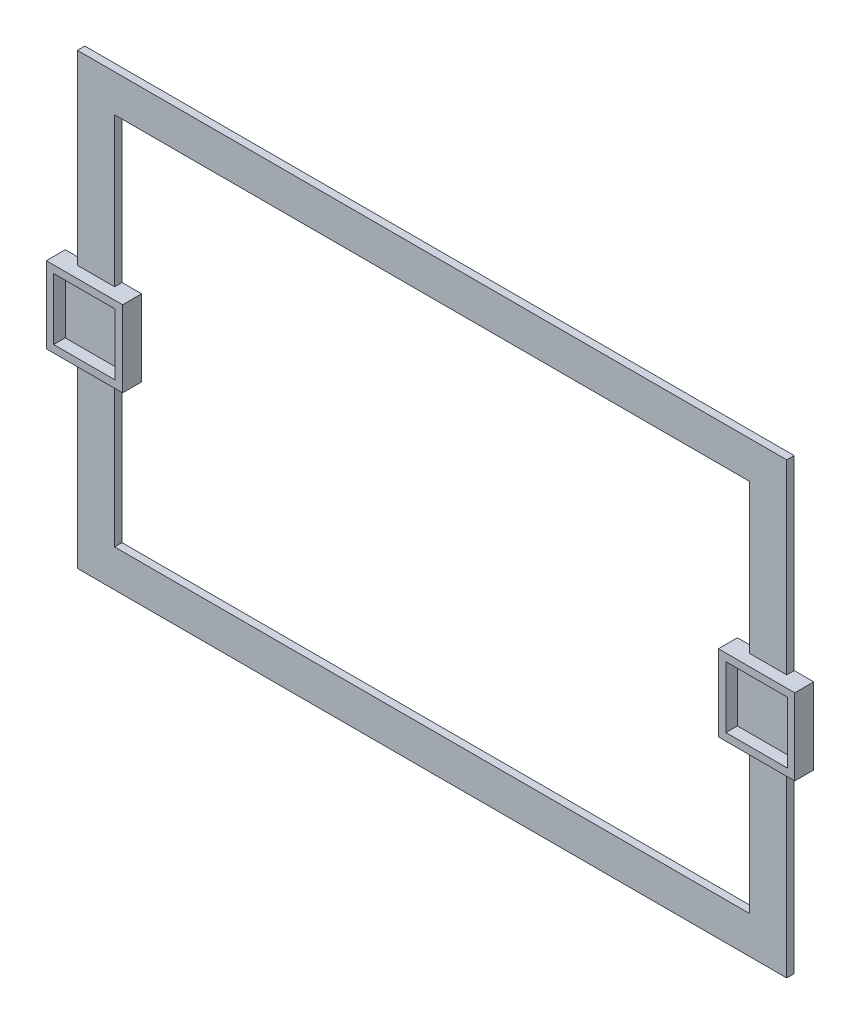
ISO-10303-21;
HEADER;
FILE_DESCRIPTION(('STEP AP214'),'2;1');
FILE_NAME('part.step','',(''),(''),'','','');
FILE_SCHEMA(('AUTOMOTIVE_DESIGN { 1 0 10303 214 1 1 1 1 }'));
ENDSEC;
DATA;
#1=APPLICATION_CONTEXT('core data for automotive mechanical design processes');
#2=APPLICATION_PROTOCOL_DEFINITION('international standard','automotive_design',2000,#1);
#3=PRODUCT_CONTEXT('',#1,'mechanical');
#4=PRODUCT('Part','Part','',(#3));
#5=PRODUCT_RELATED_PRODUCT_CATEGORY('part','',(#4));
#6=PRODUCT_DEFINITION_FORMATION('','',#4);
#7=PRODUCT_DEFINITION_CONTEXT('part definition',#1,'design');
#8=PRODUCT_DEFINITION('design','',#6,#7);
#9=PRODUCT_DEFINITION_SHAPE('','',#8);
#10=(LENGTH_UNIT() NAMED_UNIT(*) SI_UNIT(.MILLI.,.METRE.));
#11=(NAMED_UNIT(*) PLANE_ANGLE_UNIT() SI_UNIT($,.RADIAN.));
#12=(NAMED_UNIT(*) SI_UNIT($,.STERADIAN.) SOLID_ANGLE_UNIT());
#13=UNCERTAINTY_MEASURE_WITH_UNIT(LENGTH_MEASURE(1.E-05),#10,'distance_accuracy_value','');
#14=(GEOMETRIC_REPRESENTATION_CONTEXT(3) GLOBAL_UNCERTAINTY_ASSIGNED_CONTEXT((#13)) GLOBAL_UNIT_ASSIGNED_CONTEXT((#10,
#11,#12)) REPRESENTATION_CONTEXT('',''));
#15=CARTESIAN_POINT('',(0.,0.,0.));
#16=DIRECTION('',(0.,0.,1.));
#17=DIRECTION('',(1.,0.,0.));
#18=AXIS2_PLACEMENT_3D('',#15,#16,#17);
#19=CARTESIAN_POINT('',(0.,0.,0.));
#20=DIRECTION('',(0.,0.,-1.));
#21=DIRECTION('',(-1.,0.,0.));
#22=AXIS2_PLACEMENT_3D('',#19,#20,#21);
#23=PLANE('',#22);
#24=DIRECTION('',(1.,0.,0.));
#25=VECTOR('',#24,1.);
#26=CARTESIAN_POINT('',(453.39,-5.07999999999991,0.));
#27=LINE('',#26,#25);
#28=CARTESIAN_POINT('',(466.725,-5.07999999999991,0.));
#29=VERTEX_POINT('',#28);
#30=CARTESIAN_POINT('',(492.125,-5.07999999999991,0.));
#31=VERTEX_POINT('',#30);
#32=EDGE_CURVE('E270',#29,#31,#27,.T.);
#33=ORIENTED_EDGE('',*,*,#32,.F.);
#34=DIRECTION('',(0.,-1.,0.));
#35=VECTOR('',#34,1.);
#36=CARTESIAN_POINT('',(466.725,0.,0.));
#37=LINE('',#36,#35);
#38=CARTESIAN_POINT('',(466.725,-106.68,0.));
#39=VERTEX_POINT('',#38);
#40=EDGE_CURVE('E354',#29,#39,#37,.T.);
#41=ORIENTED_EDGE('',*,*,#40,.T.);
#42=DIRECTION('',(1.,0.,0.));
#43=VECTOR('',#42,1.);
#44=CARTESIAN_POINT('',(0.,-106.68,0.));
#45=LINE('',#44,#43);
#46=CARTESIAN_POINT('',(33.655,-106.68,0.));
#47=VERTEX_POINT('',#46);
#48=EDGE_CURVE('E360',#47,#39,#45,.T.);
#49=ORIENTED_EDGE('',*,*,#48,.F.);
#50=DIRECTION('',(0.,-1.,0.));
#51=VECTOR('',#50,1.);
#52=CARTESIAN_POINT('',(33.655,0.,0.));
#53=LINE('',#52,#51);
#54=CARTESIAN_POINT('',(33.655,-5.08,0.));
#55=VERTEX_POINT('',#54);
#56=EDGE_CURVE('E393',#55,#47,#53,.T.);
#57=ORIENTED_EDGE('',*,*,#56,.F.);
#58=DIRECTION('',(-1.,0.,0.));
#59=VECTOR('',#58,1.);
#60=CARTESIAN_POINT('',(0.,-5.08,0.));
#61=LINE('',#60,#59);
#62=CARTESIAN_POINT('',(8.25499999999999,-5.08,0.));
#63=VERTEX_POINT('',#62);
#64=EDGE_CURVE('E389',#55,#63,#61,.T.);
#65=ORIENTED_EDGE('',*,*,#64,.T.);
#66=DIRECTION('',(0.,-1.,0.));
#67=VECTOR('',#66,1.);
#68=CARTESIAN_POINT('',(8.255,0.,0.));
#69=LINE('',#68,#67);
#70=CARTESIAN_POINT('',(8.25499999999998,-132.08,0.));
#71=VERTEX_POINT('',#70);
#72=EDGE_CURVE('E385',#63,#71,#69,.T.);
#73=ORIENTED_EDGE('',*,*,#72,.T.);
#74=DIRECTION('',(-1.,0.,0.));
#75=VECTOR('',#74,1.);
#76=CARTESIAN_POINT('',(0.,-132.08,0.));
#77=LINE('',#76,#75);
#78=CARTESIAN_POINT('',(492.125,-132.08,0.));
#79=VERTEX_POINT('',#78);
#80=EDGE_CURVE('E381',#79,#71,#77,.T.);
#81=ORIENTED_EDGE('',*,*,#80,.F.);
#82=DIRECTION('',(0.,-1.,0.));
#83=VECTOR('',#82,1.);
#84=CARTESIAN_POINT('',(492.125,0.,0.));
#85=LINE('',#84,#83);
#86=EDGE_CURVE('E378',#31,#79,#85,.T.);
#87=ORIENTED_EDGE('',*,*,#86,.F.);
#88=EDGE_LOOP('',(#33,#41,#49,#57,#65,#73,#81,#87));
#89=FACE_BOUND('',#88,.T.);
#90=ADVANCED_FACE('F41',(#89),#23,.F.);
#91=DIRECTION('',(-1.,0.,0.));
#92=VECTOR('',#91,1.);
#93=CARTESIAN_POINT('',(453.39,46.9900000000001,0.));
#94=LINE('',#93,#92);
#95=CARTESIAN_POINT('',(492.125,46.9900000000001,0.));
#96=VERTEX_POINT('',#95);
#97=CARTESIAN_POINT('',(466.725,46.9900000000001,0.));
#98=VERTEX_POINT('',#97);
#99=EDGE_CURVE('E309',#96,#98,#94,.T.);
#100=ORIENTED_EDGE('',*,*,#99,.F.);
#101=DIRECTION('',(0.,1.,0.));
#102=VECTOR('',#101,1.);
#103=CARTESIAN_POINT('',(492.125,0.,0.));
#104=LINE('',#103,#102);
#105=CARTESIAN_POINT('',(492.125,173.99,0.));
#106=VERTEX_POINT('',#105);
#107=EDGE_CURVE('E432',#96,#106,#104,.T.);
#108=ORIENTED_EDGE('',*,*,#107,.T.);
#109=DIRECTION('',(1.,0.,0.));
#110=VECTOR('',#109,1.);
#111=CARTESIAN_POINT('',(0.,173.99,0.));
#112=LINE('',#111,#110);
#113=CARTESIAN_POINT('',(8.25500000000001,173.99,0.));
#114=VERTEX_POINT('',#113);
#115=EDGE_CURVE('E467',#114,#106,#112,.T.);
#116=ORIENTED_EDGE('',*,*,#115,.F.);
#117=DIRECTION('',(0.,1.,0.));
#118=VECTOR('',#117,1.);
#119=CARTESIAN_POINT('',(8.25500000000001,0.,0.));
#120=LINE('',#119,#118);
#121=CARTESIAN_POINT('',(8.25500000000001,46.99,0.));
#122=VERTEX_POINT('',#121);
#123=EDGE_CURVE('E464',#122,#114,#120,.T.);
#124=ORIENTED_EDGE('',*,*,#123,.F.);
#125=DIRECTION('',(1.,0.,0.));
#126=VECTOR('',#125,1.);
#127=CARTESIAN_POINT('',(0.,46.99,0.));
#128=LINE('',#127,#126);
#129=CARTESIAN_POINT('',(33.655,46.99,0.));
#130=VERTEX_POINT('',#129);
#131=EDGE_CURVE('E460',#122,#130,#128,.T.);
#132=ORIENTED_EDGE('',*,*,#131,.T.);
#133=DIRECTION('',(0.,1.,0.));
#134=VECTOR('',#133,1.);
#135=CARTESIAN_POINT('',(33.655,0.,0.));
#136=LINE('',#135,#134);
#137=CARTESIAN_POINT('',(33.655,148.59,0.));
#138=VERTEX_POINT('',#137);
#139=EDGE_CURVE('E456',#130,#138,#136,.T.);
#140=ORIENTED_EDGE('',*,*,#139,.T.);
#141=DIRECTION('',(-1.,0.,0.));
#142=VECTOR('',#141,1.);
#143=CARTESIAN_POINT('',(0.,148.59,0.));
#144=LINE('',#143,#142);
#145=CARTESIAN_POINT('',(466.725,148.59,0.));
#146=VERTEX_POINT('',#145);
#147=EDGE_CURVE('E452',#146,#138,#144,.T.);
#148=ORIENTED_EDGE('',*,*,#147,.F.);
#149=DIRECTION('',(0.,1.,0.));
#150=VECTOR('',#149,1.);
#151=CARTESIAN_POINT('',(466.725,0.,0.));
#152=LINE('',#151,#150);
#153=EDGE_CURVE('E427',#98,#146,#152,.T.);
#154=ORIENTED_EDGE('',*,*,#153,.F.);
#155=EDGE_LOOP('',(#100,#108,#116,#124,#132,#140,#148,#154));
#156=FACE_BOUND('',#155,.T.);
#157=ADVANCED_FACE('F661',(#156),#23,.F.);
#158=CARTESIAN_POINT('',(0.,0.,7.874));
#159=DIRECTION('',(0.,0.,1.));
#160=DIRECTION('',(1.,0.,0.));
#161=AXIS2_PLACEMENT_3D('',#158,#159,#160);
#162=PLANE('',#161);
#163=DIRECTION('',(0.,-1.,0.));
#164=VECTOR('',#163,1.);
#165=CARTESIAN_POINT('',(-5.08,46.99,7.874));
#166=LINE('',#165,#164);
#167=CARTESIAN_POINT('',(-5.08,46.99,7.874));
#168=VERTEX_POINT('',#167);
#169=CARTESIAN_POINT('',(-5.07999999999999,-5.08,7.874));
#170=VERTEX_POINT('',#169);
#171=EDGE_CURVE('E562',#168,#170,#166,.T.);
#172=ORIENTED_EDGE('',*,*,#171,.T.);
#173=DIRECTION('',(1.,0.,0.));
#174=VECTOR('',#173,1.);
#175=CARTESIAN_POINT('',(-5.07999999999999,-5.08,7.874));
#176=LINE('',#175,#174);
#177=CARTESIAN_POINT('',(46.99,-5.08,7.874));
#178=VERTEX_POINT('',#177);
#179=EDGE_CURVE('E566',#170,#178,#176,.T.);
#180=ORIENTED_EDGE('',*,*,#179,.T.);
#181=DIRECTION('',(0.,1.,0.));
#182=VECTOR('',#181,1.);
#183=CARTESIAN_POINT('',(46.99,46.99,7.874));
#184=LINE('',#183,#182);
#185=CARTESIAN_POINT('',(46.99,46.99,7.874));
#186=VERTEX_POINT('',#185);
#187=EDGE_CURVE('E569',#178,#186,#184,.T.);
#188=ORIENTED_EDGE('',*,*,#187,.T.);
#189=DIRECTION('',(-1.,0.,0.));
#190=VECTOR('',#189,1.);
#191=CARTESIAN_POINT('',(-5.08,46.99,7.874));
#192=LINE('',#191,#190);
#193=EDGE_CURVE('E572',#186,#168,#192,.T.);
#194=ORIENTED_EDGE('',*,*,#193,.T.);
#195=EDGE_LOOP('',(#172,#180,#188,#194));
#196=FACE_BOUND('',#195,.T.);
#197=DIRECTION('',(1.,0.,0.));
#198=VECTOR('',#197,1.);
#199=CARTESIAN_POINT('',(0.,0.,7.874));
#200=LINE('',#199,#198);
#201=CARTESIAN_POINT('',(0.,0.,7.874));
#202=VERTEX_POINT('',#201);
#203=CARTESIAN_POINT('',(41.91,0.,7.874));
#204=VERTEX_POINT('',#203);
#205=EDGE_CURVE('E524',#202,#204,#200,.T.);
#206=ORIENTED_EDGE('',*,*,#205,.F.);
#207=DIRECTION('',(0.,-1.,0.));
#208=VECTOR('',#207,1.);
#209=CARTESIAN_POINT('',(0.,0.,7.874));
#210=LINE('',#209,#208);
#211=CARTESIAN_POINT('',(0.,41.91,7.874));
#212=VERTEX_POINT('',#211);
#213=EDGE_CURVE('E521',#212,#202,#210,.T.);
#214=ORIENTED_EDGE('',*,*,#213,.F.);
#215=DIRECTION('',(-1.,0.,0.));
#216=VECTOR('',#215,1.);
#217=CARTESIAN_POINT('',(0.,41.91,7.874));
#218=LINE('',#217,#216);
#219=CARTESIAN_POINT('',(41.91,41.91,7.874));
#220=VERTEX_POINT('',#219);
#221=EDGE_CURVE('E532',#220,#212,#218,.T.);
#222=ORIENTED_EDGE('',*,*,#221,.F.);
#223=DIRECTION('',(0.,1.,0.));
#224=VECTOR('',#223,1.);
#225=CARTESIAN_POINT('',(41.91,0.,7.874));
#226=LINE('',#225,#224);
#227=EDGE_CURVE('E528',#204,#220,#226,.T.);
#228=ORIENTED_EDGE('',*,*,#227,.F.);
#229=EDGE_LOOP('',(#206,#214,#222,#228));
#230=FACE_BOUND('',#229,.T.);
#231=ADVANCED_FACE('F701',(#196,#230),#162,.T.);
#232=CARTESIAN_POINT('',(-5.08,46.99,7.874));
#233=DIRECTION('',(1.,0.,0.));
#234=DIRECTION('',(0.,1.,0.));
#235=AXIS2_PLACEMENT_3D('',#232,#233,#234);
#236=PLANE('',#235);
#237=DIRECTION('',(0.,0.,-1.));
#238=VECTOR('',#237,1.);
#239=CARTESIAN_POINT('',(-5.08,46.99,7.874));
#240=LINE('',#239,#238);
#241=CARTESIAN_POINT('',(-5.07999999999999,46.99,-5.08));
#242=VERTEX_POINT('',#241);
#243=EDGE_CURVE('E575',#168,#242,#240,.T.);
#244=ORIENTED_EDGE('',*,*,#243,.T.);
#245=DIRECTION('',(0.,1.,0.));
#246=VECTOR('',#245,1.);
#247=CARTESIAN_POINT('',(-5.07999999999999,-5.08,-5.08));
#248=LINE('',#247,#246);
#249=CARTESIAN_POINT('',(-5.07999999999999,-5.08,-5.08));
#250=VERTEX_POINT('',#249);
#251=EDGE_CURVE('E502',#250,#242,#248,.T.);
#252=ORIENTED_EDGE('',*,*,#251,.F.);
#253=DIRECTION('',(0.,0.,-1.));
#254=VECTOR('',#253,1.);
#255=CARTESIAN_POINT('',(-5.07999999999999,-5.08,7.874));
#256=LINE('',#255,#254);
#257=EDGE_CURVE('E11',#170,#250,#256,.T.);
#258=ORIENTED_EDGE('',*,*,#257,.F.);
#259=ORIENTED_EDGE('',*,*,#171,.F.);
#260=EDGE_LOOP('',(#244,#252,#258,#259));
#261=FACE_BOUND('',#260,.T.);
#262=ADVANCED_FACE('F43',(#261),#236,.F.);
#263=CARTESIAN_POINT('',(-5.07999999999999,-5.08,7.874));
#264=DIRECTION('',(0.,1.,0.));
#265=DIRECTION('',(0.,0.,1.));
#266=AXIS2_PLACEMENT_3D('',#263,#264,#265);
#267=PLANE('',#266);
#268=DIRECTION('',(-1.,0.,0.));
#269=VECTOR('',#268,1.);
#270=CARTESIAN_POINT('',(-5.07999999999999,-5.08,-5.08));
#271=LINE('',#270,#269);
#272=CARTESIAN_POINT('',(8.25499999999999,-5.08,-5.08));
#273=VERTEX_POINT('',#272);
#274=EDGE_CURVE('E515',#273,#250,#271,.T.);
#275=ORIENTED_EDGE('',*,*,#274,.F.);
#276=DIRECTION('',(0.,0.,1.));
#277=VECTOR('',#276,1.);
#278=CARTESIAN_POINT('',(8.25499999999999,-5.08,-5.08));
#279=LINE('',#278,#277);
#280=EDGE_CURVE('E408',#273,#63,#279,.T.);
#281=ORIENTED_EDGE('',*,*,#280,.T.);
#282=ORIENTED_EDGE('',*,*,#64,.F.);
#283=DIRECTION('',(0.,0.,1.));
#284=VECTOR('',#283,1.);
#285=CARTESIAN_POINT('',(33.655,-5.08,-5.08));
#286=LINE('',#285,#284);
#287=CARTESIAN_POINT('',(33.655,-5.08,-5.08));
#288=VERTEX_POINT('',#287);
#289=EDGE_CURVE('E405',#288,#55,#286,.T.);
#290=ORIENTED_EDGE('',*,*,#289,.F.);
#291=CARTESIAN_POINT('',(46.99,-5.08,-5.08));
#292=VERTEX_POINT('',#291);
#293=EDGE_CURVE('E516',#292,#288,#271,.T.);
#294=ORIENTED_EDGE('',*,*,#293,.F.);
#295=DIRECTION('',(0.,0.,-1.));
#296=VECTOR('',#295,1.);
#297=CARTESIAN_POINT('',(46.99,-5.08,7.874));
#298=LINE('',#297,#296);
#299=EDGE_CURVE('E50',#178,#292,#298,.T.);
#300=ORIENTED_EDGE('',*,*,#299,.F.);
#301=ORIENTED_EDGE('',*,*,#179,.F.);
#302=ORIENTED_EDGE('',*,*,#257,.T.);
#303=EDGE_LOOP('',(#275,#281,#282,#290,#294,#300,#301,#302));
#304=FACE_BOUND('',#303,.T.);
#305=ADVANCED_FACE('F595',(#304),#267,.F.);
#306=CARTESIAN_POINT('',(46.99,46.99,7.874));
#307=DIRECTION('',(-1.,0.,0.));
#308=DIRECTION('',(0.,-1.,0.));
#309=AXIS2_PLACEMENT_3D('',#306,#307,#308);
#310=PLANE('',#309);
#311=ORIENTED_EDGE('',*,*,#299,.T.);
#312=DIRECTION('',(0.,-1.,0.));
#313=VECTOR('',#312,1.);
#314=CARTESIAN_POINT('',(46.99,-5.08,-5.08));
#315=LINE('',#314,#313);
#316=CARTESIAN_POINT('',(46.99,46.99,-5.08));
#317=VERTEX_POINT('',#316);
#318=EDGE_CURVE('E511',#317,#292,#315,.T.);
#319=ORIENTED_EDGE('',*,*,#318,.F.);
#320=DIRECTION('',(0.,0.,-1.));
#321=VECTOR('',#320,1.);
#322=CARTESIAN_POINT('',(46.99,46.99,7.874));
#323=LINE('',#322,#321);
#324=EDGE_CURVE('E578',#186,#317,#323,.T.);
#325=ORIENTED_EDGE('',*,*,#324,.F.);
#326=ORIENTED_EDGE('',*,*,#187,.F.);
#327=EDGE_LOOP('',(#311,#319,#325,#326));
#328=FACE_BOUND('',#327,.T.);
#329=ADVANCED_FACE('F586',(#328),#310,.F.);
#330=CARTESIAN_POINT('',(-5.08,46.99,7.874));
#331=DIRECTION('',(0.,-1.,0.));
#332=DIRECTION('',(0.,0.,-1.));
#333=AXIS2_PLACEMENT_3D('',#330,#331,#332);
#334=PLANE('',#333);
#335=DIRECTION('',(1.,0.,0.));
#336=VECTOR('',#335,1.);
#337=CARTESIAN_POINT('',(-5.07999999999999,46.99,-5.08));
#338=LINE('',#337,#336);
#339=CARTESIAN_POINT('',(33.655,46.99,-5.08));
#340=VERTEX_POINT('',#339);
#341=EDGE_CURVE('E506',#340,#317,#338,.T.);
#342=ORIENTED_EDGE('',*,*,#341,.F.);
#343=DIRECTION('',(0.,0.,1.));
#344=VECTOR('',#343,1.);
#345=CARTESIAN_POINT('',(33.655,46.99,-5.08));
#346=LINE('',#345,#344);
#347=EDGE_CURVE('E487',#340,#130,#346,.T.);
#348=ORIENTED_EDGE('',*,*,#347,.T.);
#349=ORIENTED_EDGE('',*,*,#131,.F.);
#350=DIRECTION('',(0.,0.,1.));
#351=VECTOR('',#350,1.);
#352=CARTESIAN_POINT('',(8.25500000000001,46.99,-5.08));
#353=LINE('',#352,#351);
#354=CARTESIAN_POINT('',(8.25500000000001,46.99,-5.08));
#355=VERTEX_POINT('',#354);
#356=EDGE_CURVE('E484',#355,#122,#353,.T.);
#357=ORIENTED_EDGE('',*,*,#356,.F.);
#358=EDGE_CURVE('E507',#242,#355,#338,.T.);
#359=ORIENTED_EDGE('',*,*,#358,.F.);
#360=ORIENTED_EDGE('',*,*,#243,.F.);
#361=ORIENTED_EDGE('',*,*,#193,.F.);
#362=ORIENTED_EDGE('',*,*,#324,.T.);
#363=EDGE_LOOP('',(#342,#348,#349,#357,#359,#360,#361,#362));
#364=FACE_BOUND('',#363,.T.);
#365=ADVANCED_FACE('F653',(#364),#334,.F.);
#366=CARTESIAN_POINT('',(0.,0.,7.874));
#367=DIRECTION('',(1.,0.,0.));
#368=DIRECTION('',(0.,0.,-1.));
#369=AXIS2_PLACEMENT_3D('',#366,#367,#368);
#370=PLANE('',#369);
#371=DIRECTION('',(0.,-1.,0.));
#372=VECTOR('',#371,1.);
#373=CARTESIAN_POINT('',(0.,0.,0.));
#374=LINE('',#373,#372);
#375=CARTESIAN_POINT('',(0.,41.91,0.));
#376=VERTEX_POINT('',#375);
#377=CARTESIAN_POINT('',(0.,0.,0.));
#378=VERTEX_POINT('',#377);
#379=EDGE_CURVE('E520',#376,#378,#374,.T.);
#380=ORIENTED_EDGE('',*,*,#379,.F.);
#381=DIRECTION('',(0.,0.,-1.));
#382=VECTOR('',#381,1.);
#383=CARTESIAN_POINT('',(0.,41.91,7.874));
#384=LINE('',#383,#382);
#385=EDGE_CURVE('E535',#212,#376,#384,.T.);
#386=ORIENTED_EDGE('',*,*,#385,.F.);
#387=ORIENTED_EDGE('',*,*,#213,.T.);
#388=DIRECTION('',(0.,0.,-1.));
#389=VECTOR('',#388,1.);
#390=CARTESIAN_POINT('',(0.,0.,7.874));
#391=LINE('',#390,#389);
#392=EDGE_CURVE('E558',#202,#378,#391,.T.);
#393=ORIENTED_EDGE('',*,*,#392,.T.);
#394=EDGE_LOOP('',(#380,#386,#387,#393));
#395=FACE_BOUND('',#394,.T.);
#396=ADVANCED_FACE('F775',(#395),#370,.T.);
#397=CARTESIAN_POINT('',(0.,0.,7.874));
#398=DIRECTION('',(0.,1.,0.));
#399=DIRECTION('',(0.,0.,1.));
#400=AXIS2_PLACEMENT_3D('',#397,#398,#399);
#401=PLANE('',#400);
#402=DIRECTION('',(1.,0.,0.));
#403=VECTOR('',#402,1.);
#404=CARTESIAN_POINT('',(0.,0.,0.));
#405=LINE('',#404,#403);
#406=CARTESIAN_POINT('',(41.91,0.,0.));
#407=VERTEX_POINT('',#406);
#408=EDGE_CURVE('E539',#378,#407,#405,.T.);
#409=ORIENTED_EDGE('',*,*,#408,.F.);
#410=ORIENTED_EDGE('',*,*,#392,.F.);
#411=ORIENTED_EDGE('',*,*,#205,.T.);
#412=DIRECTION('',(0.,0.,-1.));
#413=VECTOR('',#412,1.);
#414=CARTESIAN_POINT('',(41.91,0.,7.874));
#415=LINE('',#414,#413);
#416=EDGE_CURVE('E555',#204,#407,#415,.T.);
#417=ORIENTED_EDGE('',*,*,#416,.T.);
#418=EDGE_LOOP('',(#409,#410,#411,#417));
#419=FACE_BOUND('',#418,.T.);
#420=ADVANCED_FACE('F771',(#419),#401,.T.);
#421=CARTESIAN_POINT('',(41.91,0.,7.874));
#422=DIRECTION('',(-1.,0.,0.));
#423=DIRECTION('',(0.,0.,1.));
#424=AXIS2_PLACEMENT_3D('',#421,#422,#423);
#425=PLANE('',#424);
#426=DIRECTION('',(0.,1.,0.));
#427=VECTOR('',#426,1.);
#428=CARTESIAN_POINT('',(41.91,0.,0.));
#429=LINE('',#428,#427);
#430=CARTESIAN_POINT('',(41.91,41.91,0.));
#431=VERTEX_POINT('',#430);
#432=EDGE_CURVE('E543',#407,#431,#429,.T.);
#433=ORIENTED_EDGE('',*,*,#432,.F.);
#434=ORIENTED_EDGE('',*,*,#416,.F.);
#435=ORIENTED_EDGE('',*,*,#227,.T.);
#436=DIRECTION('',(0.,0.,-1.));
#437=VECTOR('',#436,1.);
#438=CARTESIAN_POINT('',(41.91,41.91,7.874));
#439=LINE('',#438,#437);
#440=EDGE_CURVE('E552',#220,#431,#439,.T.);
#441=ORIENTED_EDGE('',*,*,#440,.T.);
#442=EDGE_LOOP('',(#433,#434,#435,#441));
#443=FACE_BOUND('',#442,.T.);
#444=ADVANCED_FACE('F767',(#443),#425,.T.);
#445=CARTESIAN_POINT('',(0.,41.91,7.874));
#446=DIRECTION('',(0.,-1.,0.));
#447=DIRECTION('',(0.,0.,-1.));
#448=AXIS2_PLACEMENT_3D('',#445,#446,#447);
#449=PLANE('',#448);
#450=DIRECTION('',(-1.,0.,0.));
#451=VECTOR('',#450,1.);
#452=CARTESIAN_POINT('',(0.,41.91,0.));
#453=LINE('',#452,#451);
#454=EDGE_CURVE('E525',#431,#376,#453,.T.);
#455=ORIENTED_EDGE('',*,*,#454,.F.);
#456=ORIENTED_EDGE('',*,*,#440,.F.);
#457=ORIENTED_EDGE('',*,*,#221,.T.);
#458=ORIENTED_EDGE('',*,*,#385,.T.);
#459=EDGE_LOOP('',(#455,#456,#457,#458));
#460=FACE_BOUND('',#459,.T.);
#461=ADVANCED_FACE('F763',(#460),#449,.T.);
#462=CARTESIAN_POINT('',(0.,0.,0.));
#463=DIRECTION('',(0.,0.,-1.));
#464=DIRECTION('',(-1.,0.,0.));
#465=AXIS2_PLACEMENT_3D('',#462,#463,#464);
#466=PLANE('',#465);
#467=ORIENTED_EDGE('',*,*,#454,.T.);
#468=ORIENTED_EDGE('',*,*,#379,.T.);
#469=ORIENTED_EDGE('',*,*,#408,.T.);
#470=ORIENTED_EDGE('',*,*,#432,.T.);
#471=EDGE_LOOP('',(#467,#468,#469,#470));
#472=FACE_BOUND('',#471,.T.);
#473=ADVANCED_FACE('F760',(#472),#466,.F.);
#474=CARTESIAN_POINT('',(0.,0.,-5.08));
#475=DIRECTION('',(0.,0.,-1.));
#476=DIRECTION('',(-1.,0.,0.));
#477=AXIS2_PLACEMENT_3D('',#474,#475,#476);
#478=PLANE('',#477);
#479=DIRECTION('',(0.,1.,0.));
#480=VECTOR('',#479,1.);
#481=CARTESIAN_POINT('',(492.125,0.,-5.08));
#482=LINE('',#481,#480);
#483=CARTESIAN_POINT('',(492.125,46.9900000000001,-5.08));
#484=VERTEX_POINT('',#483);
#485=CARTESIAN_POINT('',(492.125,173.99,-5.08));
#486=VERTEX_POINT('',#485);
#487=EDGE_CURVE('E445',#484,#486,#482,.T.);
#488=ORIENTED_EDGE('',*,*,#487,.F.);
#489=DIRECTION('',(1.,0.,0.));
#490=VECTOR('',#489,1.);
#491=CARTESIAN_POINT('',(453.39,46.9900000000001,-5.08));
#492=LINE('',#491,#490);
#493=CARTESIAN_POINT('',(505.46,46.9900000000001,-5.08));
#494=VERTEX_POINT('',#493);
#495=EDGE_CURVE('E329',#484,#494,#492,.T.);
#496=ORIENTED_EDGE('',*,*,#495,.T.);
#497=DIRECTION('',(0.,-1.,0.));
#498=VECTOR('',#497,1.);
#499=CARTESIAN_POINT('',(505.46,-5.07999999999992,-5.08));
#500=LINE('',#499,#498);
#501=CARTESIAN_POINT('',(505.46,-5.07999999999992,-5.08));
#502=VERTEX_POINT('',#501);
#503=EDGE_CURVE('E334',#494,#502,#500,.T.);
#504=ORIENTED_EDGE('',*,*,#503,.T.);
#505=DIRECTION('',(-1.,0.,0.));
#506=VECTOR('',#505,1.);
#507=CARTESIAN_POINT('',(453.39,-5.07999999999991,-5.08));
#508=LINE('',#507,#506);
#509=CARTESIAN_POINT('',(492.125,-5.07999999999991,-5.08));
#510=VERTEX_POINT('',#509);
#511=EDGE_CURVE('E338',#502,#510,#508,.T.);
#512=ORIENTED_EDGE('',*,*,#511,.T.);
#513=DIRECTION('',(0.,-1.,0.));
#514=VECTOR('',#513,1.);
#515=CARTESIAN_POINT('',(492.125,0.,-5.08));
#516=LINE('',#515,#514);
#517=CARTESIAN_POINT('',(492.125,-132.08,-5.08));
#518=VERTEX_POINT('',#517);
#519=EDGE_CURVE('E359',#510,#518,#516,.T.);
#520=ORIENTED_EDGE('',*,*,#519,.T.);
#521=DIRECTION('',(-1.,0.,0.));
#522=VECTOR('',#521,1.);
#523=CARTESIAN_POINT('',(0.,-132.08,-5.08));
#524=LINE('',#523,#522);
#525=CARTESIAN_POINT('',(8.25499999999998,-132.08,-5.08));
#526=VERTEX_POINT('',#525);
#527=EDGE_CURVE('E363',#518,#526,#524,.T.);
#528=ORIENTED_EDGE('',*,*,#527,.T.);
#529=DIRECTION('',(0.,-1.,0.));
#530=VECTOR('',#529,1.);
#531=CARTESIAN_POINT('',(8.255,0.,-5.08));
#532=LINE('',#531,#530);
#533=EDGE_CURVE('E65',#273,#526,#532,.T.);
#534=ORIENTED_EDGE('',*,*,#533,.F.);
#535=ORIENTED_EDGE('',*,*,#274,.T.);
#536=ORIENTED_EDGE('',*,*,#251,.T.);
#537=ORIENTED_EDGE('',*,*,#358,.T.);
#538=DIRECTION('',(0.,1.,0.));
#539=VECTOR('',#538,1.);
#540=CARTESIAN_POINT('',(8.25500000000001,0.,-5.08));
#541=LINE('',#540,#539);
#542=CARTESIAN_POINT('',(8.25500000000001,173.99,-5.08));
#543=VERTEX_POINT('',#542);
#544=EDGE_CURVE('E439',#355,#543,#541,.T.);
#545=ORIENTED_EDGE('',*,*,#544,.T.);
#546=DIRECTION('',(1.,0.,0.));
#547=VECTOR('',#546,1.);
#548=CARTESIAN_POINT('',(0.,173.99,-5.08));
#549=LINE('',#548,#547);
#550=EDGE_CURVE('E442',#543,#486,#549,.T.);
#551=ORIENTED_EDGE('',*,*,#550,.T.);
#552=EDGE_LOOP('',(#488,#496,#504,#512,#520,#528,#534,#535,#536,#537,#545,#551));
#553=FACE_BOUND('',#552,.T.);
#554=CARTESIAN_POINT('',(453.39,46.9900000000001,-5.08));
#555=VERTEX_POINT('',#554);
#556=CARTESIAN_POINT('',(466.725,46.9900000000001,-5.08));
#557=VERTEX_POINT('',#556);
#558=EDGE_CURVE('E330',#555,#557,#492,.T.);
#559=ORIENTED_EDGE('',*,*,#558,.T.);
#560=DIRECTION('',(0.,1.,0.));
#561=VECTOR('',#560,1.);
#562=CARTESIAN_POINT('',(466.725,0.,-5.08));
#563=LINE('',#562,#561);
#564=CARTESIAN_POINT('',(466.725,148.59,-5.08));
#565=VERTEX_POINT('',#564);
#566=EDGE_CURVE('E428',#557,#565,#563,.T.);
#567=ORIENTED_EDGE('',*,*,#566,.T.);
#568=DIRECTION('',(-1.,0.,0.));
#569=VECTOR('',#568,1.);
#570=CARTESIAN_POINT('',(0.,148.59,-5.08));
#571=LINE('',#570,#569);
#572=CARTESIAN_POINT('',(33.655,148.59,-5.08));
#573=VERTEX_POINT('',#572);
#574=EDGE_CURVE('E431',#565,#573,#571,.T.);
#575=ORIENTED_EDGE('',*,*,#574,.T.);
#576=DIRECTION('',(0.,1.,0.));
#577=VECTOR('',#576,1.);
#578=CARTESIAN_POINT('',(33.655,0.,-5.08));
#579=LINE('',#578,#577);
#580=EDGE_CURVE('E435',#340,#573,#579,.T.);
#581=ORIENTED_EDGE('',*,*,#580,.F.);
#582=ORIENTED_EDGE('',*,*,#341,.T.);
#583=ORIENTED_EDGE('',*,*,#318,.T.);
#584=ORIENTED_EDGE('',*,*,#293,.T.);
#585=DIRECTION('',(0.,-1.,0.));
#586=VECTOR('',#585,1.);
#587=CARTESIAN_POINT('',(33.655,0.,-5.08));
#588=LINE('',#587,#586);
#589=CARTESIAN_POINT('',(33.655,-106.68,-5.08));
#590=VERTEX_POINT('',#589);
#591=EDGE_CURVE('E368',#288,#590,#588,.T.);
#592=ORIENTED_EDGE('',*,*,#591,.T.);
#593=DIRECTION('',(1.,0.,0.));
#594=VECTOR('',#593,1.);
#595=CARTESIAN_POINT('',(0.,-106.68,-5.08));
#596=LINE('',#595,#594);
#597=CARTESIAN_POINT('',(466.725,-106.68,-5.08));
#598=VERTEX_POINT('',#597);
#599=EDGE_CURVE('E371',#590,#598,#596,.T.);
#600=ORIENTED_EDGE('',*,*,#599,.T.);
#601=DIRECTION('',(0.,-1.,0.));
#602=VECTOR('',#601,1.);
#603=CARTESIAN_POINT('',(466.725,0.,-5.08));
#604=LINE('',#603,#602);
#605=CARTESIAN_POINT('',(466.725,-5.07999999999991,-5.08));
#606=VERTEX_POINT('',#605);
#607=EDGE_CURVE('E355',#606,#598,#604,.T.);
#608=ORIENTED_EDGE('',*,*,#607,.F.);
#609=CARTESIAN_POINT('',(453.39,-5.07999999999991,-5.08));
#610=VERTEX_POINT('',#609);
#611=EDGE_CURVE('E337',#606,#610,#508,.T.);
#612=ORIENTED_EDGE('',*,*,#611,.T.);
#613=DIRECTION('',(0.,1.,0.));
#614=VECTOR('',#613,1.);
#615=CARTESIAN_POINT('',(453.39,-5.07999999999991,-5.08));
#616=LINE('',#615,#614);
#617=EDGE_CURVE('E321',#610,#555,#616,.T.);
#618=ORIENTED_EDGE('',*,*,#617,.T.);
#619=EDGE_LOOP('',(#559,#567,#575,#581,#582,#583,#584,#592,#600,#608,#612,#618));
#620=FACE_BOUND('',#619,.T.);
#621=ADVANCED_FACE('F591',(#553,#620),#478,.T.);
#622=CARTESIAN_POINT('',(466.725,0.,-5.08));
#623=DIRECTION('',(1.,0.,0.));
#624=DIRECTION('',(0.,0.,-1.));
#625=AXIS2_PLACEMENT_3D('',#622,#623,#624);
#626=PLANE('',#625);
#627=ORIENTED_EDGE('',*,*,#153,.T.);
#628=DIRECTION('',(0.,0.,1.));
#629=VECTOR('',#628,1.);
#630=CARTESIAN_POINT('',(466.725,148.59,-5.08));
#631=LINE('',#630,#629);
#632=EDGE_CURVE('E494',#565,#146,#631,.T.);
#633=ORIENTED_EDGE('',*,*,#632,.F.);
#634=ORIENTED_EDGE('',*,*,#566,.F.);
#635=DIRECTION('',(0.,0.,1.));
#636=VECTOR('',#635,1.);
#637=CARTESIAN_POINT('',(466.725,46.9900000000001,-5.08));
#638=LINE('',#637,#636);
#639=EDGE_CURVE('E498',#557,#98,#638,.T.);
#640=ORIENTED_EDGE('',*,*,#639,.T.);
#641=EDGE_LOOP('',(#627,#633,#634,#640));
#642=FACE_BOUND('',#641,.T.);
#643=ADVANCED_FACE('F672',(#642),#626,.F.);
#644=CARTESIAN_POINT('',(0.,148.59,-5.08));
#645=DIRECTION('',(0.,1.,0.));
#646=DIRECTION('',(0.,0.,1.));
#647=AXIS2_PLACEMENT_3D('',#644,#645,#646);
#648=PLANE('',#647);
#649=ORIENTED_EDGE('',*,*,#147,.T.);
#650=DIRECTION('',(0.,0.,1.));
#651=VECTOR('',#650,1.);
#652=CARTESIAN_POINT('',(33.655,148.59,-5.08));
#653=LINE('',#652,#651);
#654=EDGE_CURVE('E491',#573,#138,#653,.T.);
#655=ORIENTED_EDGE('',*,*,#654,.F.);
#656=ORIENTED_EDGE('',*,*,#574,.F.);
#657=ORIENTED_EDGE('',*,*,#632,.T.);
#658=EDGE_LOOP('',(#649,#655,#656,#657));
#659=FACE_BOUND('',#658,.T.);
#660=ADVANCED_FACE('F677',(#659),#648,.F.);
#661=CARTESIAN_POINT('',(33.655,0.,-5.08));
#662=DIRECTION('',(1.,0.,0.));
#663=DIRECTION('',(0.,0.,-1.));
#664=AXIS2_PLACEMENT_3D('',#661,#662,#663);
#665=PLANE('',#664);
#666=ORIENTED_EDGE('',*,*,#139,.F.);
#667=ORIENTED_EDGE('',*,*,#347,.F.);
#668=ORIENTED_EDGE('',*,*,#580,.T.);
#669=ORIENTED_EDGE('',*,*,#654,.T.);
#670=EDGE_LOOP('',(#666,#667,#668,#669));
#671=FACE_BOUND('',#670,.T.);
#672=ADVANCED_FACE('F750',(#671),#665,.T.);
#673=CARTESIAN_POINT('',(8.25500000000001,0.,-5.08));
#674=DIRECTION('',(1.,0.,0.));
#675=DIRECTION('',(0.,0.,-1.));
#676=AXIS2_PLACEMENT_3D('',#673,#674,#675);
#677=PLANE('',#676);
#678=ORIENTED_EDGE('',*,*,#123,.T.);
#679=DIRECTION('',(0.,0.,1.));
#680=VECTOR('',#679,1.);
#681=CARTESIAN_POINT('',(8.25500000000001,173.99,-5.08));
#682=LINE('',#681,#680);
#683=EDGE_CURVE('E480',#543,#114,#682,.T.);
#684=ORIENTED_EDGE('',*,*,#683,.F.);
#685=ORIENTED_EDGE('',*,*,#544,.F.);
#686=ORIENTED_EDGE('',*,*,#356,.T.);
#687=EDGE_LOOP('',(#678,#684,#685,#686));
#688=FACE_BOUND('',#687,.T.);
#689=ADVANCED_FACE('F657',(#688),#677,.F.);
#690=CARTESIAN_POINT('',(0.,173.99,-5.08));
#691=DIRECTION('',(0.,-1.,0.));
#692=DIRECTION('',(0.,0.,-1.));
#693=AXIS2_PLACEMENT_3D('',#690,#691,#692);
#694=PLANE('',#693);
#695=ORIENTED_EDGE('',*,*,#115,.T.);
#696=DIRECTION('',(0.,0.,1.));
#697=VECTOR('',#696,1.);
#698=CARTESIAN_POINT('',(492.125,173.99,-5.08));
#699=LINE('',#698,#697);
#700=EDGE_CURVE('E477',#486,#106,#699,.T.);
#701=ORIENTED_EDGE('',*,*,#700,.F.);
#702=ORIENTED_EDGE('',*,*,#550,.F.);
#703=ORIENTED_EDGE('',*,*,#683,.T.);
#704=EDGE_LOOP('',(#695,#701,#702,#703));
#705=FACE_BOUND('',#704,.T.);
#706=ADVANCED_FACE('F665',(#705),#694,.F.);
#707=CARTESIAN_POINT('',(492.125,0.,-5.08));
#708=DIRECTION('',(1.,0.,0.));
#709=DIRECTION('',(0.,0.,-1.));
#710=AXIS2_PLACEMENT_3D('',#707,#708,#709);
#711=PLANE('',#710);
#712=ORIENTED_EDGE('',*,*,#107,.F.);
#713=DIRECTION('',(0.,0.,1.));
#714=VECTOR('',#713,1.);
#715=CARTESIAN_POINT('',(492.125,46.9900000000001,-5.08));
#716=LINE('',#715,#714);
#717=EDGE_CURVE('E449',#484,#96,#716,.T.);
#718=ORIENTED_EDGE('',*,*,#717,.F.);
#719=ORIENTED_EDGE('',*,*,#487,.T.);
#720=ORIENTED_EDGE('',*,*,#700,.T.);
#721=EDGE_LOOP('',(#712,#718,#719,#720));
#722=FACE_BOUND('',#721,.T.);
#723=ADVANCED_FACE('F668',(#722),#711,.T.);
#724=CARTESIAN_POINT('',(466.725,0.,-5.08));
#725=DIRECTION('',(-1.,0.,0.));
#726=DIRECTION('',(0.,0.,1.));
#727=AXIS2_PLACEMENT_3D('',#724,#725,#726);
#728=PLANE('',#727);
#729=ORIENTED_EDGE('',*,*,#40,.F.);
#730=DIRECTION('',(0.,0.,1.));
#731=VECTOR('',#730,1.);
#732=CARTESIAN_POINT('',(466.725,-5.07999999999991,-5.08));
#733=LINE('',#732,#731);
#734=EDGE_CURVE('E423',#606,#29,#733,.T.);
#735=ORIENTED_EDGE('',*,*,#734,.F.);
#736=ORIENTED_EDGE('',*,*,#607,.T.);
#737=DIRECTION('',(0.,0.,1.));
#738=VECTOR('',#737,1.);
#739=CARTESIAN_POINT('',(466.725,-106.68,-5.08));
#740=LINE('',#739,#738);
#741=EDGE_CURVE('E374',#598,#39,#740,.T.);
#742=ORIENTED_EDGE('',*,*,#741,.T.);
#743=EDGE_LOOP('',(#729,#735,#736,#742));
#744=FACE_BOUND('',#743,.T.);
#745=ADVANCED_FACE('F738',(#744),#728,.T.);
#746=CARTESIAN_POINT('',(492.125,0.,-5.08));
#747=DIRECTION('',(-1.,0.,0.));
#748=DIRECTION('',(0.,0.,1.));
#749=AXIS2_PLACEMENT_3D('',#746,#747,#748);
#750=PLANE('',#749);
#751=ORIENTED_EDGE('',*,*,#86,.T.);
#752=DIRECTION('',(0.,0.,1.));
#753=VECTOR('',#752,1.);
#754=CARTESIAN_POINT('',(492.125,-132.08,-5.08));
#755=LINE('',#754,#753);
#756=EDGE_CURVE('E415',#518,#79,#755,.T.);
#757=ORIENTED_EDGE('',*,*,#756,.F.);
#758=ORIENTED_EDGE('',*,*,#519,.F.);
#759=DIRECTION('',(0.,0.,1.));
#760=VECTOR('',#759,1.);
#761=CARTESIAN_POINT('',(492.125,-5.07999999999991,-5.08));
#762=LINE('',#761,#760);
#763=EDGE_CURVE('E419',#510,#31,#762,.T.);
#764=ORIENTED_EDGE('',*,*,#763,.T.);
#765=EDGE_LOOP('',(#751,#757,#758,#764));
#766=FACE_BOUND('',#765,.T.);
#767=ADVANCED_FACE('F635',(#766),#750,.F.);
#768=CARTESIAN_POINT('',(0.,-132.08,-5.08));
#769=DIRECTION('',(0.,1.,0.));
#770=DIRECTION('',(0.,0.,1.));
#771=AXIS2_PLACEMENT_3D('',#768,#769,#770);
#772=PLANE('',#771);
#773=ORIENTED_EDGE('',*,*,#80,.T.);
#774=DIRECTION('',(0.,0.,1.));
#775=VECTOR('',#774,1.);
#776=CARTESIAN_POINT('',(8.25499999999998,-132.08,-5.08));
#777=LINE('',#776,#775);
#778=EDGE_CURVE('E412',#526,#71,#777,.T.);
#779=ORIENTED_EDGE('',*,*,#778,.F.);
#780=ORIENTED_EDGE('',*,*,#527,.F.);
#781=ORIENTED_EDGE('',*,*,#756,.T.);
#782=EDGE_LOOP('',(#773,#779,#780,#781));
#783=FACE_BOUND('',#782,.T.);
#784=ADVANCED_FACE('F639',(#783),#772,.F.);
#785=CARTESIAN_POINT('',(8.255,0.,-5.08));
#786=DIRECTION('',(-1.,0.,0.));
#787=DIRECTION('',(0.,-1.,0.));
#788=AXIS2_PLACEMENT_3D('',#785,#786,#787);
#789=PLANE('',#788);
#790=ORIENTED_EDGE('',*,*,#72,.F.);
#791=ORIENTED_EDGE('',*,*,#280,.F.);
#792=ORIENTED_EDGE('',*,*,#533,.T.);
#793=ORIENTED_EDGE('',*,*,#778,.T.);
#794=EDGE_LOOP('',(#790,#791,#792,#793));
#795=FACE_BOUND('',#794,.T.);
#796=ADVANCED_FACE('F641',(#795),#789,.T.);
#797=CARTESIAN_POINT('',(33.655,0.,-5.08));
#798=DIRECTION('',(-1.,0.,0.));
#799=DIRECTION('',(0.,-1.,0.));
#800=AXIS2_PLACEMENT_3D('',#797,#798,#799);
#801=PLANE('',#800);
#802=ORIENTED_EDGE('',*,*,#56,.T.);
#803=DIRECTION('',(0.,0.,1.));
#804=VECTOR('',#803,1.);
#805=CARTESIAN_POINT('',(33.655,-106.68,-5.08));
#806=LINE('',#805,#804);
#807=EDGE_CURVE('E401',#590,#47,#806,.T.);
#808=ORIENTED_EDGE('',*,*,#807,.F.);
#809=ORIENTED_EDGE('',*,*,#591,.F.);
#810=ORIENTED_EDGE('',*,*,#289,.T.);
#811=EDGE_LOOP('',(#802,#808,#809,#810));
#812=FACE_BOUND('',#811,.T.);
#813=ADVANCED_FACE('F599',(#812),#801,.F.);
#814=CARTESIAN_POINT('',(0.,-106.68,-5.08));
#815=DIRECTION('',(0.,-1.,0.));
#816=DIRECTION('',(1.,0.,0.));
#817=AXIS2_PLACEMENT_3D('',#814,#815,#816);
#818=PLANE('',#817);
#819=ORIENTED_EDGE('',*,*,#48,.T.);
#820=ORIENTED_EDGE('',*,*,#741,.F.);
#821=ORIENTED_EDGE('',*,*,#599,.F.);
#822=ORIENTED_EDGE('',*,*,#807,.T.);
#823=EDGE_LOOP('',(#819,#820,#821,#822));
#824=FACE_BOUND('',#823,.T.);
#825=ADVANCED_FACE('F606',(#824),#818,.F.);
#826=CARTESIAN_POINT('',(453.39,46.9900000000001,-5.08));
#827=DIRECTION('',(0.,-1.,0.));
#828=DIRECTION('',(1.,0.,0.));
#829=AXIS2_PLACEMENT_3D('',#826,#827,#828);
#830=PLANE('',#829);
#831=DIRECTION('',(0.,0.,1.));
#832=VECTOR('',#831,1.);
#833=CARTESIAN_POINT('',(453.39,46.9900000000001,-5.08));
#834=LINE('',#833,#832);
#835=CARTESIAN_POINT('',(453.39,46.9900000000001,7.874));
#836=VERTEX_POINT('',#835);
#837=EDGE_CURVE('E351',#555,#836,#834,.T.);
#838=ORIENTED_EDGE('',*,*,#837,.T.);
#839=DIRECTION('',(-1.,0.,0.));
#840=VECTOR('',#839,1.);
#841=CARTESIAN_POINT('',(453.39,46.9900000000001,7.874));
#842=LINE('',#841,#840);
#843=CARTESIAN_POINT('',(505.46,46.9900000000001,7.874));
#844=VERTEX_POINT('',#843);
#845=EDGE_CURVE('E317',#844,#836,#842,.T.);
#846=ORIENTED_EDGE('',*,*,#845,.F.);
#847=DIRECTION('',(0.,0.,1.));
#848=VECTOR('',#847,1.);
#849=CARTESIAN_POINT('',(505.46,46.9900000000001,-5.08));
#850=LINE('',#849,#848);
#851=EDGE_CURVE('E348',#494,#844,#850,.T.);
#852=ORIENTED_EDGE('',*,*,#851,.F.);
#853=ORIENTED_EDGE('',*,*,#495,.F.);
#854=ORIENTED_EDGE('',*,*,#717,.T.);
#855=ORIENTED_EDGE('',*,*,#99,.T.);
#856=ORIENTED_EDGE('',*,*,#639,.F.);
#857=ORIENTED_EDGE('',*,*,#558,.F.);
#858=EDGE_LOOP('',(#838,#846,#852,#853,#854,#855,#856,#857));
#859=FACE_BOUND('',#858,.T.);
#860=ADVANCED_FACE('F625',(#859),#830,.F.);
#861=CARTESIAN_POINT('',(453.39,-5.07999999999991,-5.08));
#862=DIRECTION('',(0.,1.,0.));
#863=DIRECTION('',(-1.,0.,0.));
#864=AXIS2_PLACEMENT_3D('',#861,#862,#863);
#865=PLANE('',#864);
#866=DIRECTION('',(0.,0.,1.));
#867=VECTOR('',#866,1.);
#868=CARTESIAN_POINT('',(505.46,-5.07999999999992,-5.08));
#869=LINE('',#868,#867);
#870=CARTESIAN_POINT('',(505.46,-5.07999999999991,7.874));
#871=VERTEX_POINT('',#870);
#872=EDGE_CURVE('E345',#502,#871,#869,.T.);
#873=ORIENTED_EDGE('',*,*,#872,.T.);
#874=DIRECTION('',(1.,0.,0.));
#875=VECTOR('',#874,1.);
#876=CARTESIAN_POINT('',(453.39,-5.07999999999991,7.874));
#877=LINE('',#876,#875);
#878=CARTESIAN_POINT('',(453.39,-5.07999999999991,7.874));
#879=VERTEX_POINT('',#878);
#880=EDGE_CURVE('E308',#879,#871,#877,.T.);
#881=ORIENTED_EDGE('',*,*,#880,.F.);
#882=DIRECTION('',(0.,0.,1.));
#883=VECTOR('',#882,1.);
#884=CARTESIAN_POINT('',(453.39,-5.07999999999991,-5.08));
#885=LINE('',#884,#883);
#886=EDGE_CURVE('E342',#610,#879,#885,.T.);
#887=ORIENTED_EDGE('',*,*,#886,.F.);
#888=ORIENTED_EDGE('',*,*,#611,.F.);
#889=ORIENTED_EDGE('',*,*,#734,.T.);
#890=ORIENTED_EDGE('',*,*,#32,.T.);
#891=ORIENTED_EDGE('',*,*,#763,.F.);
#892=ORIENTED_EDGE('',*,*,#511,.F.);
#893=EDGE_LOOP('',(#873,#881,#887,#888,#889,#890,#891,#892));
#894=FACE_BOUND('',#893,.T.);
#895=ADVANCED_FACE('F613',(#894),#865,.F.);
#896=CARTESIAN_POINT('',(453.39,-5.07999999999991,-5.08));
#897=DIRECTION('',(1.,0.,0.));
#898=DIRECTION('',(0.,0.,-1.));
#899=AXIS2_PLACEMENT_3D('',#896,#897,#898);
#900=PLANE('',#899);
#901=ORIENTED_EDGE('',*,*,#886,.T.);
#902=DIRECTION('',(0.,-1.,0.));
#903=VECTOR('',#902,1.);
#904=CARTESIAN_POINT('',(453.39,46.9900000000001,7.874));
#905=LINE('',#904,#903);
#906=EDGE_CURVE('E304',#836,#879,#905,.T.);
#907=ORIENTED_EDGE('',*,*,#906,.F.);
#908=ORIENTED_EDGE('',*,*,#837,.F.);
#909=ORIENTED_EDGE('',*,*,#617,.F.);
#910=EDGE_LOOP('',(#901,#907,#908,#909));
#911=FACE_BOUND('',#910,.T.);
#912=ADVANCED_FACE('F684',(#911),#900,.F.);
#913=CARTESIAN_POINT('',(505.46,-5.07999999999992,-5.08));
#914=DIRECTION('',(-1.,0.,0.));
#915=DIRECTION('',(0.,0.,1.));
#916=AXIS2_PLACEMENT_3D('',#913,#914,#915);
#917=PLANE('',#916);
#918=ORIENTED_EDGE('',*,*,#851,.T.);
#919=DIRECTION('',(0.,1.,0.));
#920=VECTOR('',#919,1.);
#921=CARTESIAN_POINT('',(505.46,46.9900000000001,7.874));
#922=LINE('',#921,#920);
#923=EDGE_CURVE('E313',#871,#844,#922,.T.);
#924=ORIENTED_EDGE('',*,*,#923,.F.);
#925=ORIENTED_EDGE('',*,*,#872,.F.);
#926=ORIENTED_EDGE('',*,*,#503,.F.);
#927=EDGE_LOOP('',(#918,#924,#925,#926));
#928=FACE_BOUND('',#927,.T.);
#929=ADVANCED_FACE('F628',(#928),#917,.F.);
#930=CARTESIAN_POINT('',(0.,0.,7.874));
#931=DIRECTION('',(0.,0.,1.));
#932=DIRECTION('',(1.,0.,0.));
#933=AXIS2_PLACEMENT_3D('',#930,#931,#932);
#934=PLANE('',#933);
#935=ORIENTED_EDGE('',*,*,#906,.T.);
#936=ORIENTED_EDGE('',*,*,#880,.T.);
#937=ORIENTED_EDGE('',*,*,#923,.T.);
#938=ORIENTED_EDGE('',*,*,#845,.T.);
#939=EDGE_LOOP('',(#935,#936,#937,#938));
#940=FACE_BOUND('',#939,.T.);
#941=DIRECTION('',(1.,0.,0.));
#942=VECTOR('',#941,1.);
#943=CARTESIAN_POINT('',(458.47,1.2490009027033E-13,7.874));
#944=LINE('',#943,#942);
#945=CARTESIAN_POINT('',(458.47,1.2490009027033E-13,7.874));
#946=VERTEX_POINT('',#945);
#947=CARTESIAN_POINT('',(500.38,1.21430643318376E-13,7.874));
#948=VERTEX_POINT('',#947);
#949=EDGE_CURVE('E261',#946,#948,#944,.T.);
#950=ORIENTED_EDGE('',*,*,#949,.F.);
#951=DIRECTION('',(0.,-1.,0.));
#952=VECTOR('',#951,1.);
#953=CARTESIAN_POINT('',(458.47,41.9100000000001,7.874));
#954=LINE('',#953,#952);
#955=CARTESIAN_POINT('',(458.47,41.9100000000001,7.874));
#956=VERTEX_POINT('',#955);
#957=EDGE_CURVE('E252',#956,#946,#954,.T.);
#958=ORIENTED_EDGE('',*,*,#957,.F.);
#959=DIRECTION('',(-1.,0.,0.));
#960=VECTOR('',#959,1.);
#961=CARTESIAN_POINT('',(458.47,41.9100000000001,7.874));
#962=LINE('',#961,#960);
#963=CARTESIAN_POINT('',(500.38,41.9100000000001,7.874));
#964=VERTEX_POINT('',#963);
#965=EDGE_CURVE('E280',#964,#956,#962,.T.);
#966=ORIENTED_EDGE('',*,*,#965,.F.);
#967=DIRECTION('',(0.,1.,0.));
#968=VECTOR('',#967,1.);
#969=CARTESIAN_POINT('',(500.38,41.9100000000001,7.874));
#970=LINE('',#969,#968);
#971=EDGE_CURVE('E276',#948,#964,#970,.T.);
#972=ORIENTED_EDGE('',*,*,#971,.F.);
#973=EDGE_LOOP('',(#950,#958,#966,#972));
#974=FACE_BOUND('',#973,.T.);
#975=ADVANCED_FACE('F274',(#940,#974),#934,.T.);
#976=CARTESIAN_POINT('',(458.47,41.9100000000001,7.874));
#977=DIRECTION('',(1.,0.,0.));
#978=DIRECTION('',(0.,0.,-1.));
#979=AXIS2_PLACEMENT_3D('',#976,#977,#978);
#980=PLANE('',#979);
#981=DIRECTION('',(0.,-1.,0.));
#982=VECTOR('',#981,1.);
#983=CARTESIAN_POINT('',(458.47,41.9100000000001,0.));
#984=LINE('',#983,#982);
#985=CARTESIAN_POINT('',(458.47,41.9100000000001,0.));
#986=VERTEX_POINT('',#985);
#987=CARTESIAN_POINT('',(458.47,1.2490009027033E-13,0.));
#988=VERTEX_POINT('',#987);
#989=EDGE_CURVE('E285',#986,#988,#984,.T.);
#990=ORIENTED_EDGE('',*,*,#989,.F.);
#991=DIRECTION('',(0.,0.,-1.));
#992=VECTOR('',#991,1.);
#993=CARTESIAN_POINT('',(458.47,41.9100000000001,7.874));
#994=LINE('',#993,#992);
#995=EDGE_CURVE('E57',#956,#986,#994,.T.);
#996=ORIENTED_EDGE('',*,*,#995,.F.);
#997=ORIENTED_EDGE('',*,*,#957,.T.);
#998=DIRECTION('',(0.,0.,-1.));
#999=VECTOR('',#998,1.);
#1000=CARTESIAN_POINT('',(458.47,1.2490009027033E-13,7.874));
#1001=LINE('',#1000,#999);
#1002=EDGE_CURVE('E255',#946,#988,#1001,.T.);
#1003=ORIENTED_EDGE('',*,*,#1002,.T.);
#1004=EDGE_LOOP('',(#990,#996,#997,#1003));
#1005=FACE_BOUND('',#1004,.T.);
#1006=ADVANCED_FACE('F254',(#1005),#980,.T.);
#1007=CARTESIAN_POINT('',(458.47,1.2490009027033E-13,7.874));
#1008=DIRECTION('',(0.,1.,0.));
#1009=DIRECTION('',(-1.,0.,0.));
#1010=AXIS2_PLACEMENT_3D('',#1007,#1008,#1009);
#1011=PLANE('',#1010);
#1012=DIRECTION('',(1.,0.,0.));
#1013=VECTOR('',#1012,1.);
#1014=CARTESIAN_POINT('',(458.47,1.2490009027033E-13,0.));
#1015=LINE('',#1014,#1013);
#1016=CARTESIAN_POINT('',(500.38,1.21430643318376E-13,0.));
#1017=VERTEX_POINT('',#1016);
#1018=EDGE_CURVE('E268',#988,#1017,#1015,.T.);
#1019=ORIENTED_EDGE('',*,*,#1018,.F.);
#1020=ORIENTED_EDGE('',*,*,#1002,.F.);
#1021=ORIENTED_EDGE('',*,*,#949,.T.);
#1022=DIRECTION('',(0.,0.,-1.));
#1023=VECTOR('',#1022,1.);
#1024=CARTESIAN_POINT('',(500.38,1.21430643318376E-13,7.874));
#1025=LINE('',#1024,#1023);
#1026=EDGE_CURVE('E271',#948,#1017,#1025,.T.);
#1027=ORIENTED_EDGE('',*,*,#1026,.T.);
#1028=EDGE_LOOP('',(#1019,#1020,#1021,#1027));
#1029=FACE_BOUND('',#1028,.T.);
#1030=ADVANCED_FACE('F265',(#1029),#1011,.T.);
#1031=CARTESIAN_POINT('',(500.38,41.9100000000001,7.874));
#1032=DIRECTION('',(-1.,0.,0.));
#1033=DIRECTION('',(0.,0.,1.));
#1034=AXIS2_PLACEMENT_3D('',#1031,#1032,#1033);
#1035=PLANE('',#1034);
#1036=DIRECTION('',(0.,1.,0.));
#1037=VECTOR('',#1036,1.);
#1038=CARTESIAN_POINT('',(500.38,41.9100000000001,0.));
#1039=LINE('',#1038,#1037);
#1040=CARTESIAN_POINT('',(500.38,41.9100000000001,0.));
#1041=VERTEX_POINT('',#1040);
#1042=EDGE_CURVE('E290',#1017,#1041,#1039,.T.);
#1043=ORIENTED_EDGE('',*,*,#1042,.F.);
#1044=ORIENTED_EDGE('',*,*,#1026,.F.);
#1045=ORIENTED_EDGE('',*,*,#971,.T.);
#1046=DIRECTION('',(0.,0.,-1.));
#1047=VECTOR('',#1046,1.);
#1048=CARTESIAN_POINT('',(500.38,41.9100000000001,7.874));
#1049=LINE('',#1048,#1047);
#1050=EDGE_CURVE('E299',#964,#1041,#1049,.T.);
#1051=ORIENTED_EDGE('',*,*,#1050,.T.);
#1052=EDGE_LOOP('',(#1043,#1044,#1045,#1051));
#1053=FACE_BOUND('',#1052,.T.);
#1054=ADVANCED_FACE('F710',(#1053),#1035,.T.);
#1055=CARTESIAN_POINT('',(458.47,41.9100000000001,7.874));
#1056=DIRECTION('',(0.,-1.,0.));
#1057=DIRECTION('',(1.,0.,0.));
#1058=AXIS2_PLACEMENT_3D('',#1055,#1056,#1057);
#1059=PLANE('',#1058);
#1060=DIRECTION('',(-1.,0.,0.));
#1061=VECTOR('',#1060,1.);
#1062=CARTESIAN_POINT('',(458.47,41.9100000000001,0.));
#1063=LINE('',#1062,#1061);
#1064=EDGE_CURVE('E262',#1041,#986,#1063,.T.);
#1065=ORIENTED_EDGE('',*,*,#1064,.F.);
#1066=ORIENTED_EDGE('',*,*,#1050,.F.);
#1067=ORIENTED_EDGE('',*,*,#965,.T.);
#1068=ORIENTED_EDGE('',*,*,#995,.T.);
#1069=EDGE_LOOP('',(#1065,#1066,#1067,#1068));
#1070=FACE_BOUND('',#1069,.T.);
#1071=ADVANCED_FACE('F705',(#1070),#1059,.T.);
#1072=ORIENTED_EDGE('',*,*,#1064,.T.);
#1073=ORIENTED_EDGE('',*,*,#989,.T.);
#1074=ORIENTED_EDGE('',*,*,#1018,.T.);
#1075=ORIENTED_EDGE('',*,*,#1042,.T.);
#1076=EDGE_LOOP('',(#1072,#1073,#1074,#1075));
#1077=FACE_BOUND('',#1076,.T.);
#1078=ADVANCED_FACE('F697',(#1077),#23,.F.);
#1079=CLOSED_SHELL('',(#90,#157,#231,#262,#305,#329,#365,#396,#420,#444,#461,#473,#621,#643,
#660,#672,#689,#706,#723,#745,#767,#784,#796,#813,#825,#860,#895,#912,#929,#975,#1006,#1030,
#1054,#1071,#1078));
#1080=MANIFOLD_SOLID_BREP('B2',#1079);
#1081=ADVANCED_BREP_SHAPE_REPRESENTATION('',(#18,#1080),#14);
#1082=SHAPE_DEFINITION_REPRESENTATION(#9,#1081);
ENDSEC;
END-ISO-10303-21;
